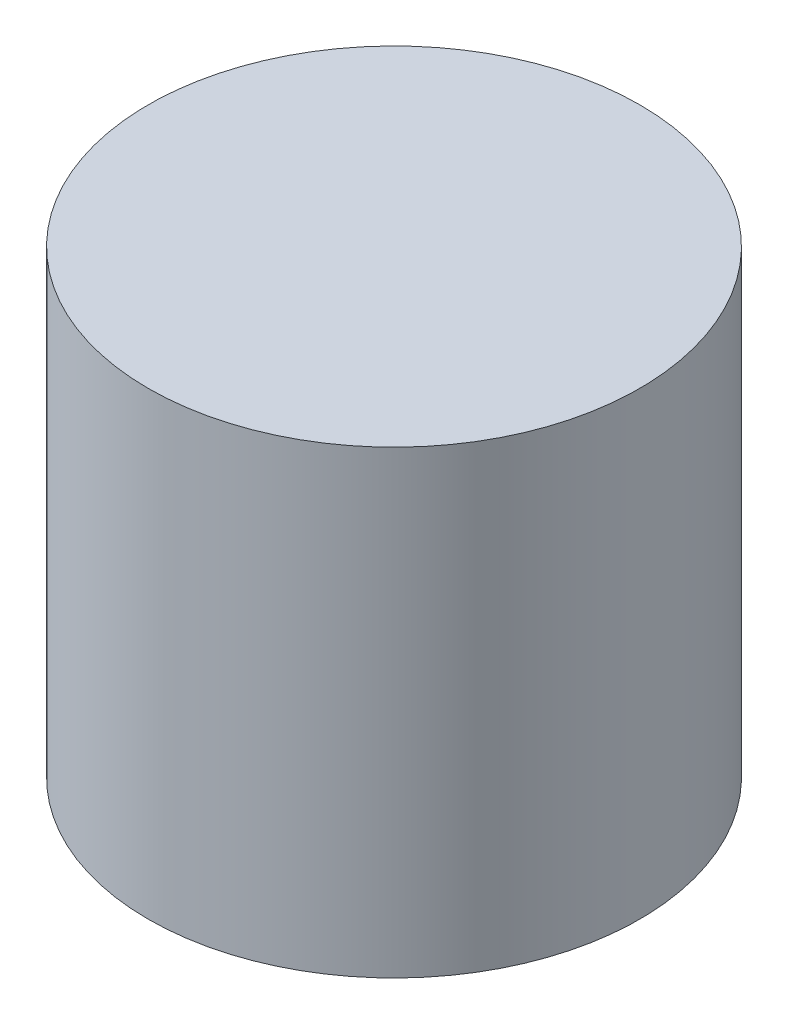
ISO-10303-21;
HEADER;
FILE_DESCRIPTION(('STEP AP214'),'2;1');
FILE_NAME('part.step','',(''),(''),'','','');
FILE_SCHEMA(('AUTOMOTIVE_DESIGN { 1 0 10303 214 1 1 1 1 }'));
ENDSEC;
DATA;
#1=APPLICATION_CONTEXT('core data for automotive mechanical design processes');
#2=APPLICATION_PROTOCOL_DEFINITION('international standard','automotive_design',2000,#1);
#3=PRODUCT_CONTEXT('',#1,'mechanical');
#4=PRODUCT('Part','Part','',(#3));
#5=PRODUCT_RELATED_PRODUCT_CATEGORY('part','',(#4));
#6=PRODUCT_DEFINITION_FORMATION('','',#4);
#7=PRODUCT_DEFINITION_CONTEXT('part definition',#1,'design');
#8=PRODUCT_DEFINITION('design','',#6,#7);
#9=PRODUCT_DEFINITION_SHAPE('','',#8);
#10=(LENGTH_UNIT() NAMED_UNIT(*) SI_UNIT(.MILLI.,.METRE.));
#11=(NAMED_UNIT(*) PLANE_ANGLE_UNIT() SI_UNIT($,.RADIAN.));
#12=(NAMED_UNIT(*) SI_UNIT($,.STERADIAN.) SOLID_ANGLE_UNIT());
#13=UNCERTAINTY_MEASURE_WITH_UNIT(LENGTH_MEASURE(1.E-05),#10,'distance_accuracy_value','');
#14=(GEOMETRIC_REPRESENTATION_CONTEXT(3) GLOBAL_UNCERTAINTY_ASSIGNED_CONTEXT((#13)) GLOBAL_UNIT_ASSIGNED_CONTEXT((#10,
#11,#12)) REPRESENTATION_CONTEXT('',''));
#15=CARTESIAN_POINT('',(0.,0.,0.));
#16=DIRECTION('',(0.,0.,1.));
#17=DIRECTION('',(1.,0.,0.));
#18=AXIS2_PLACEMENT_3D('',#15,#16,#17);
#19=CARTESIAN_POINT('',(0.,5.8,0.));
#20=DIRECTION('',(0.,-1.,0.));
#21=DIRECTION('',(0.,0.,-1.));
#22=AXIS2_PLACEMENT_3D('',#19,#20,#21);
#23=CYLINDRICAL_SURFACE('',#22,3.1);
#24=CARTESIAN_POINT('',(0.,5.8,0.));
#25=DIRECTION('',(0.,1.,0.));
#26=DIRECTION('',(0.,0.,1.));
#27=AXIS2_PLACEMENT_3D('',#24,#25,#26);
#28=CIRCLE('',#27,3.1);
#29=CARTESIAN_POINT('',(0.,5.8,3.1));
#30=VERTEX_POINT('',#29);
#31=EDGE_CURVE('E10',#30,#30,#28,.T.);
#32=ORIENTED_EDGE('',*,*,#31,.F.);
#33=EDGE_LOOP('',(#32));
#34=FACE_BOUND('',#33,.T.);
#35=CARTESIAN_POINT('',(0.,0.,0.));
#36=DIRECTION('',(0.,1.,0.));
#37=DIRECTION('',(0.,0.,1.));
#38=AXIS2_PLACEMENT_3D('',#35,#36,#37);
#39=CIRCLE('',#38,3.1);
#40=CARTESIAN_POINT('',(0.,0.,3.1));
#41=VERTEX_POINT('',#40);
#42=EDGE_CURVE('E36',#41,#41,#39,.T.);
#43=ORIENTED_EDGE('',*,*,#42,.T.);
#44=EDGE_LOOP('',(#43));
#45=FACE_BOUND('',#44,.T.);
#46=ADVANCED_FACE('F33',(#34,#45),#23,.T.);
#47=CARTESIAN_POINT('',(0.,5.8,0.));
#48=DIRECTION('',(0.,1.,0.));
#49=DIRECTION('',(0.,0.,1.));
#50=AXIS2_PLACEMENT_3D('',#47,#48,#49);
#51=PLANE('',#50);
#52=ORIENTED_EDGE('',*,*,#31,.T.);
#53=EDGE_LOOP('',(#52));
#54=FACE_BOUND('',#53,.T.);
#55=ADVANCED_FACE('F62',(#54),#51,.T.);
#56=CARTESIAN_POINT('',(0.,0.,0.));
#57=DIRECTION('',(0.,1.,0.));
#58=DIRECTION('',(0.,0.,1.));
#59=AXIS2_PLACEMENT_3D('',#56,#57,#58);
#60=PLANE('',#59);
#61=CARTESIAN_POINT('',(0.,0.,0.));
#62=DIRECTION('',(0.,-1.,0.));
#63=DIRECTION('',(0.,0.,-1.));
#64=AXIS2_PLACEMENT_3D('',#61,#62,#63);
#65=CIRCLE('',#64,1.5);
#66=CARTESIAN_POINT('',(0.,0.,-1.5));
#67=VERTEX_POINT('',#66);
#68=EDGE_CURVE('E45',#67,#67,#65,.T.);
#69=ORIENTED_EDGE('',*,*,#68,.F.);
#70=EDGE_LOOP('',(#69));
#71=FACE_BOUND('',#70,.T.);
#72=ORIENTED_EDGE('',*,*,#42,.F.);
#73=EDGE_LOOP('',(#72));
#74=FACE_BOUND('',#73,.T.);
#75=ADVANCED_FACE('F56',(#71,#74),#60,.F.);
#76=CARTESIAN_POINT('',(0.,4.8,0.));
#77=DIRECTION('',(0.,-1.,0.));
#78=DIRECTION('',(0.,0.,-1.));
#79=AXIS2_PLACEMENT_3D('',#76,#77,#78);
#80=CYLINDRICAL_SURFACE('',#79,1.5);
#81=CARTESIAN_POINT('',(0.,4.8,0.));
#82=DIRECTION('',(0.,-1.,0.));
#83=DIRECTION('',(0.,0.,-1.));
#84=AXIS2_PLACEMENT_3D('',#81,#82,#83);
#85=CIRCLE('',#84,1.5);
#86=CARTESIAN_POINT('',(0.,4.8,-1.5));
#87=VERTEX_POINT('',#86);
#88=EDGE_CURVE('E43',#87,#87,#85,.T.);
#89=ORIENTED_EDGE('',*,*,#88,.F.);
#90=EDGE_LOOP('',(#89));
#91=FACE_BOUND('',#90,.T.);
#92=ORIENTED_EDGE('',*,*,#68,.T.);
#93=EDGE_LOOP('',(#92));
#94=FACE_BOUND('',#93,.T.);
#95=ADVANCED_FACE('F53',(#91,#94),#80,.F.);
#96=CARTESIAN_POINT('',(0.,4.8,0.));
#97=DIRECTION('',(0.,-1.,0.));
#98=DIRECTION('',(0.,0.,-1.));
#99=AXIS2_PLACEMENT_3D('',#96,#97,#98);
#100=PLANE('',#99);
#101=ORIENTED_EDGE('',*,*,#88,.T.);
#102=EDGE_LOOP('',(#101));
#103=FACE_BOUND('',#102,.T.);
#104=ADVANCED_FACE('F51',(#103),#100,.T.);
#105=CLOSED_SHELL('',(#46,#55,#75,#95,#104));
#106=MANIFOLD_SOLID_BREP('B2',#105);
#107=ADVANCED_BREP_SHAPE_REPRESENTATION('',(#18,#106),#14);
#108=SHAPE_DEFINITION_REPRESENTATION(#9,#107);
ENDSEC;
END-ISO-10303-21;
